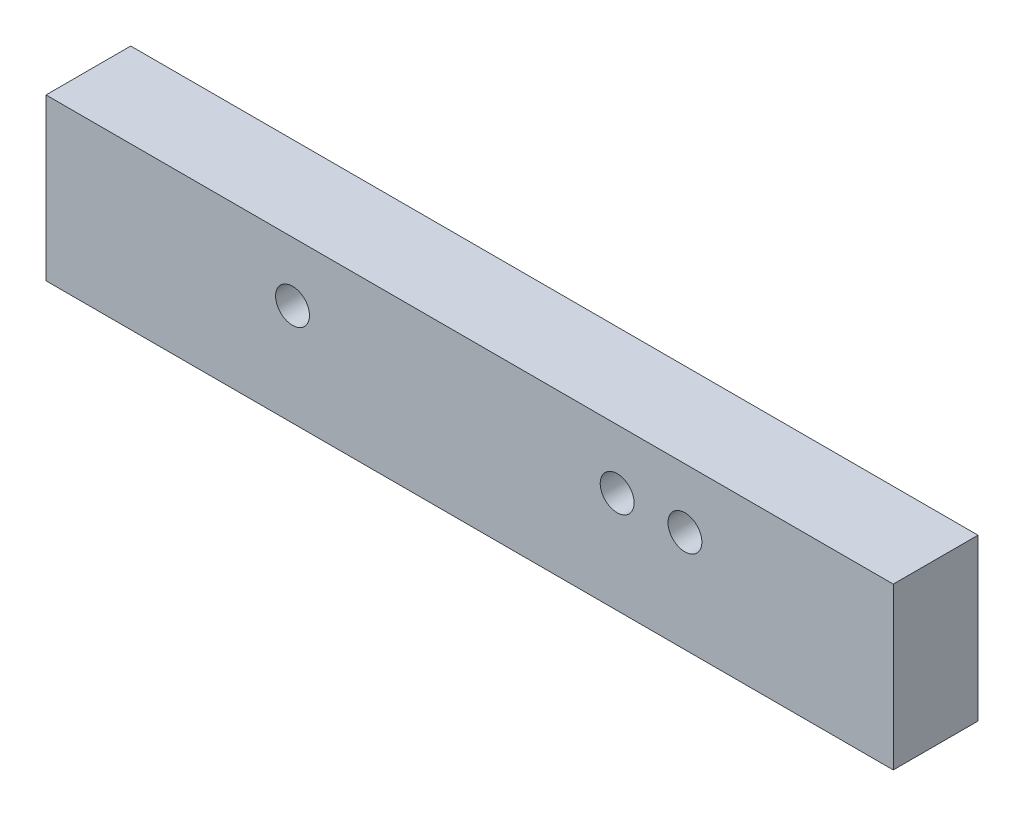
ISO-10303-21;
HEADER;
FILE_DESCRIPTION(('STEP AP214'),'2;1');
FILE_NAME('part.step','',(''),(''),'','','');
FILE_SCHEMA(('AUTOMOTIVE_DESIGN { 1 0 10303 214 1 1 1 1 }'));
ENDSEC;
DATA;
#1=APPLICATION_CONTEXT('core data for automotive mechanical design processes');
#2=APPLICATION_PROTOCOL_DEFINITION('international standard','automotive_design',2000,#1);
#3=PRODUCT_CONTEXT('',#1,'mechanical');
#4=PRODUCT('Part','Part','',(#3));
#5=PRODUCT_RELATED_PRODUCT_CATEGORY('part','',(#4));
#6=PRODUCT_DEFINITION_FORMATION('','',#4);
#7=PRODUCT_DEFINITION_CONTEXT('part definition',#1,'design');
#8=PRODUCT_DEFINITION('design','',#6,#7);
#9=PRODUCT_DEFINITION_SHAPE('','',#8);
#10=(LENGTH_UNIT() NAMED_UNIT(*) SI_UNIT(.MILLI.,.METRE.));
#11=(NAMED_UNIT(*) PLANE_ANGLE_UNIT() SI_UNIT($,.RADIAN.));
#12=(NAMED_UNIT(*) SI_UNIT($,.STERADIAN.) SOLID_ANGLE_UNIT());
#13=UNCERTAINTY_MEASURE_WITH_UNIT(LENGTH_MEASURE(1.E-05),#10,'distance_accuracy_value','');
#14=(GEOMETRIC_REPRESENTATION_CONTEXT(3) GLOBAL_UNCERTAINTY_ASSIGNED_CONTEXT((#13)) GLOBAL_UNIT_ASSIGNED_CONTEXT((#10,
#11,#12)) REPRESENTATION_CONTEXT('',''));
#15=CARTESIAN_POINT('',(0.,0.,0.));
#16=DIRECTION('',(0.,0.,1.));
#17=DIRECTION('',(1.,0.,0.));
#18=AXIS2_PLACEMENT_3D('',#15,#16,#17);
#19=CARTESIAN_POINT('',(-22.762367075413,19.5,51.));
#20=DIRECTION('',(0.,0.,-1.));
#21=DIRECTION('',(-1.,0.,0.));
#22=AXIS2_PLACEMENT_3D('',#19,#20,#21);
#23=PLANE('',#22);
#24=CARTESIAN_POINT('',(14.9428687581078,16.,51.));
#25=DIRECTION('',(0.,0.,-1.));
#26=DIRECTION('',(-1.,0.,0.));
#27=AXIS2_PLACEMENT_3D('',#24,#25,#26);
#28=CIRCLE('',#27,1.);
#29=CARTESIAN_POINT('',(13.9428687581078,16.,51.));
#30=VERTEX_POINT('',#29);
#31=EDGE_CURVE('E105',#30,#30,#28,.F.);
#32=ORIENTED_EDGE('',*,*,#31,.F.);
#33=EDGE_LOOP('',(#32));
#34=FACE_BOUND('',#33,.T.);
#35=CARTESIAN_POINT('',(10.9428687581078,16.,51.));
#36=DIRECTION('',(0.,0.,-1.));
#37=DIRECTION('',(-1.,0.,0.));
#38=AXIS2_PLACEMENT_3D('',#35,#36,#37);
#39=CIRCLE('',#38,1.);
#40=CARTESIAN_POINT('',(9.94286875810784,16.,51.));
#41=VERTEX_POINT('',#40);
#42=EDGE_CURVE('E119',#41,#41,#39,.F.);
#43=ORIENTED_EDGE('',*,*,#42,.F.);
#44=EDGE_LOOP('',(#43));
#45=FACE_BOUND('',#44,.T.);
#46=CARTESIAN_POINT('',(-8.2135610311844,16.,51.));
#47=DIRECTION('',(0.,0.,-1.));
#48=DIRECTION('',(-1.,0.,0.));
#49=AXIS2_PLACEMENT_3D('',#46,#47,#48);
#50=CIRCLE('',#49,1.);
#51=CARTESIAN_POINT('',(-9.2135610311844,16.,51.));
#52=VERTEX_POINT('',#51);
#53=EDGE_CURVE('E120',#52,#52,#50,.F.);
#54=ORIENTED_EDGE('',*,*,#53,.F.);
#55=EDGE_LOOP('',(#54));
#56=FACE_BOUND('',#55,.T.);
#57=DIRECTION('',(1.,0.,0.));
#58=VECTOR('',#57,1.);
#59=CARTESIAN_POINT('',(-22.762367075413,10.,51.));
#60=LINE('',#59,#58);
#61=CARTESIAN_POINT('',(-22.762367075413,10.,51.));
#62=VERTEX_POINT('',#61);
#63=CARTESIAN_POINT('',(27.237632924587,10.,51.));
#64=VERTEX_POINT('',#63);
#65=EDGE_CURVE('E102',#62,#64,#60,.T.);
#66=ORIENTED_EDGE('',*,*,#65,.T.);
#67=DIRECTION('',(0.,-1.,0.));
#68=VECTOR('',#67,1.);
#69=CARTESIAN_POINT('',(27.237632924587,19.5,51.));
#70=LINE('',#69,#68);
#71=CARTESIAN_POINT('',(27.237632924587,19.5,51.));
#72=VERTEX_POINT('',#71);
#73=EDGE_CURVE('E11',#72,#64,#70,.T.);
#74=ORIENTED_EDGE('',*,*,#73,.F.);
#75=DIRECTION('',(1.,0.,0.));
#76=VECTOR('',#75,1.);
#77=CARTESIAN_POINT('',(-22.762367075413,19.5,51.));
#78=LINE('',#77,#76);
#79=CARTESIAN_POINT('',(-22.762367075413,19.5,51.));
#80=VERTEX_POINT('',#79);
#81=EDGE_CURVE('E90',#80,#72,#78,.T.);
#82=ORIENTED_EDGE('',*,*,#81,.F.);
#83=DIRECTION('',(0.,-1.,0.));
#84=VECTOR('',#83,1.);
#85=CARTESIAN_POINT('',(-22.762367075413,19.5,51.));
#86=LINE('',#85,#84);
#87=EDGE_CURVE('E98',#80,#62,#86,.T.);
#88=ORIENTED_EDGE('',*,*,#87,.T.);
#89=EDGE_LOOP('',(#66,#74,#82,#88));
#90=FACE_BOUND('',#89,.T.);
#91=ADVANCED_FACE('F39',(#34,#45,#56,#90),#23,.F.);
#92=CARTESIAN_POINT('',(27.237632924587,19.5,51.));
#93=DIRECTION('',(-1.,0.,0.));
#94=DIRECTION('',(0.,0.,1.));
#95=AXIS2_PLACEMENT_3D('',#92,#93,#94);
#96=PLANE('',#95);
#97=DIRECTION('',(0.,0.,-1.));
#98=VECTOR('',#97,1.);
#99=CARTESIAN_POINT('',(27.237632924587,10.,51.));
#100=LINE('',#99,#98);
#101=CARTESIAN_POINT('',(27.237632924587,10.,46.));
#102=VERTEX_POINT('',#101);
#103=EDGE_CURVE('E94',#64,#102,#100,.T.);
#104=ORIENTED_EDGE('',*,*,#103,.T.);
#105=DIRECTION('',(0.,-1.,0.));
#106=VECTOR('',#105,1.);
#107=CARTESIAN_POINT('',(27.237632924587,19.5,46.));
#108=LINE('',#107,#106);
#109=CARTESIAN_POINT('',(27.237632924587,19.5,46.));
#110=VERTEX_POINT('',#109);
#111=EDGE_CURVE('E47',#110,#102,#108,.T.);
#112=ORIENTED_EDGE('',*,*,#111,.F.);
#113=DIRECTION('',(0.,0.,-1.));
#114=VECTOR('',#113,1.);
#115=CARTESIAN_POINT('',(27.237632924587,19.5,51.));
#116=LINE('',#115,#114);
#117=EDGE_CURVE('E85',#72,#110,#116,.T.);
#118=ORIENTED_EDGE('',*,*,#117,.F.);
#119=ORIENTED_EDGE('',*,*,#73,.T.);
#120=EDGE_LOOP('',(#104,#112,#118,#119));
#121=FACE_BOUND('',#120,.T.);
#122=ADVANCED_FACE('F93',(#121),#96,.F.);
#123=CARTESIAN_POINT('',(27.237632924587,19.5,46.));
#124=DIRECTION('',(0.,0.,1.));
#125=DIRECTION('',(1.,0.,0.));
#126=AXIS2_PLACEMENT_3D('',#123,#124,#125);
#127=PLANE('',#126);
#128=CARTESIAN_POINT('',(14.9428687581078,16.,46.));
#129=DIRECTION('',(0.,0.,-1.));
#130=DIRECTION('',(-1.,0.,0.));
#131=AXIS2_PLACEMENT_3D('',#128,#129,#130);
#132=CIRCLE('',#131,1.);
#133=CARTESIAN_POINT('',(13.9428687581078,16.,46.));
#134=VERTEX_POINT('',#133);
#135=EDGE_CURVE('E126',#134,#134,#132,.T.);
#136=ORIENTED_EDGE('',*,*,#135,.F.);
#137=EDGE_LOOP('',(#136));
#138=FACE_BOUND('',#137,.T.);
#139=CARTESIAN_POINT('',(10.9428687581078,16.,46.));
#140=DIRECTION('',(0.,0.,-1.));
#141=DIRECTION('',(-1.,0.,0.));
#142=AXIS2_PLACEMENT_3D('',#139,#140,#141);
#143=CIRCLE('',#142,1.);
#144=CARTESIAN_POINT('',(9.94286875810784,16.,46.));
#145=VERTEX_POINT('',#144);
#146=EDGE_CURVE('E123',#145,#145,#143,.T.);
#147=ORIENTED_EDGE('',*,*,#146,.F.);
#148=EDGE_LOOP('',(#147));
#149=FACE_BOUND('',#148,.T.);
#150=CARTESIAN_POINT('',(-8.2135610311844,16.,46.));
#151=DIRECTION('',(0.,0.,-1.));
#152=DIRECTION('',(-1.,0.,0.));
#153=AXIS2_PLACEMENT_3D('',#150,#151,#152);
#154=CIRCLE('',#153,1.);
#155=CARTESIAN_POINT('',(-9.2135610311844,16.,46.));
#156=VERTEX_POINT('',#155);
#157=EDGE_CURVE('E116',#156,#156,#154,.T.);
#158=ORIENTED_EDGE('',*,*,#157,.F.);
#159=EDGE_LOOP('',(#158));
#160=FACE_BOUND('',#159,.T.);
#161=DIRECTION('',(-1.,0.,0.));
#162=VECTOR('',#161,1.);
#163=CARTESIAN_POINT('',(27.237632924587,10.,46.));
#164=LINE('',#163,#162);
#165=CARTESIAN_POINT('',(-22.762367075413,10.,46.));
#166=VERTEX_POINT('',#165);
#167=EDGE_CURVE('E72',#102,#166,#164,.T.);
#168=ORIENTED_EDGE('',*,*,#167,.T.);
#169=DIRECTION('',(0.,-1.,0.));
#170=VECTOR('',#169,1.);
#171=CARTESIAN_POINT('',(-22.762367075413,19.5,46.));
#172=LINE('',#171,#170);
#173=CARTESIAN_POINT('',(-22.762367075413,19.5,46.));
#174=VERTEX_POINT('',#173);
#175=EDGE_CURVE('E95',#174,#166,#172,.T.);
#176=ORIENTED_EDGE('',*,*,#175,.F.);
#177=DIRECTION('',(-1.,0.,0.));
#178=VECTOR('',#177,1.);
#179=CARTESIAN_POINT('',(27.237632924587,19.5,46.));
#180=LINE('',#179,#178);
#181=EDGE_CURVE('E88',#110,#174,#180,.T.);
#182=ORIENTED_EDGE('',*,*,#181,.F.);
#183=ORIENTED_EDGE('',*,*,#111,.T.);
#184=EDGE_LOOP('',(#168,#176,#182,#183));
#185=FACE_BOUND('',#184,.T.);
#186=ADVANCED_FACE('F96',(#138,#149,#160,#185),#127,.F.);
#187=CARTESIAN_POINT('',(-22.762367075413,19.5,46.));
#188=DIRECTION('',(1.,0.,0.));
#189=DIRECTION('',(0.,0.,-1.));
#190=AXIS2_PLACEMENT_3D('',#187,#188,#189);
#191=PLANE('',#190);
#192=DIRECTION('',(0.,0.,1.));
#193=VECTOR('',#192,1.);
#194=CARTESIAN_POINT('',(-22.762367075413,10.,46.));
#195=LINE('',#194,#193);
#196=EDGE_CURVE('E78',#166,#62,#195,.T.);
#197=ORIENTED_EDGE('',*,*,#196,.T.);
#198=ORIENTED_EDGE('',*,*,#87,.F.);
#199=DIRECTION('',(0.,0.,1.));
#200=VECTOR('',#199,1.);
#201=CARTESIAN_POINT('',(-22.762367075413,19.5,46.));
#202=LINE('',#201,#200);
#203=EDGE_CURVE('E55',#174,#80,#202,.T.);
#204=ORIENTED_EDGE('',*,*,#203,.F.);
#205=ORIENTED_EDGE('',*,*,#175,.T.);
#206=EDGE_LOOP('',(#197,#198,#204,#205));
#207=FACE_BOUND('',#206,.T.);
#208=ADVANCED_FACE('F110',(#207),#191,.F.);
#209=CARTESIAN_POINT('',(0.,19.5,0.));
#210=DIRECTION('',(0.,1.,0.));
#211=DIRECTION('',(0.,0.,1.));
#212=AXIS2_PLACEMENT_3D('',#209,#210,#211);
#213=PLANE('',#212);
#214=ORIENTED_EDGE('',*,*,#81,.T.);
#215=ORIENTED_EDGE('',*,*,#117,.T.);
#216=ORIENTED_EDGE('',*,*,#181,.T.);
#217=ORIENTED_EDGE('',*,*,#203,.T.);
#218=EDGE_LOOP('',(#214,#215,#216,#217));
#219=FACE_BOUND('',#218,.T.);
#220=ADVANCED_FACE('F86',(#219),#213,.T.);
#221=CARTESIAN_POINT('',(0.,10.,0.));
#222=DIRECTION('',(0.,1.,0.));
#223=DIRECTION('',(0.,0.,1.));
#224=AXIS2_PLACEMENT_3D('',#221,#222,#223);
#225=PLANE('',#224);
#226=ORIENTED_EDGE('',*,*,#65,.F.);
#227=ORIENTED_EDGE('',*,*,#196,.F.);
#228=ORIENTED_EDGE('',*,*,#167,.F.);
#229=ORIENTED_EDGE('',*,*,#103,.F.);
#230=EDGE_LOOP('',(#226,#227,#228,#229));
#231=FACE_BOUND('',#230,.T.);
#232=ADVANCED_FACE('F113',(#231),#225,.F.);
#233=CARTESIAN_POINT('',(-8.2135610311844,16.,51.001));
#234=DIRECTION('',(0.,0.,-1.));
#235=DIRECTION('',(-1.,0.,0.));
#236=AXIS2_PLACEMENT_3D('',#233,#234,#235);
#237=CYLINDRICAL_SURFACE('',#236,1.);
#238=ORIENTED_EDGE('',*,*,#157,.T.);
#239=EDGE_LOOP('',(#238));
#240=FACE_BOUND('',#239,.T.);
#241=ORIENTED_EDGE('',*,*,#53,.T.);
#242=EDGE_LOOP('',(#241));
#243=FACE_BOUND('',#242,.T.);
#244=ADVANCED_FACE('F144',(#240,#243),#237,.F.);
#245=CARTESIAN_POINT('',(10.9428687581078,16.,51.001));
#246=DIRECTION('',(0.,0.,-1.));
#247=DIRECTION('',(-1.,0.,0.));
#248=AXIS2_PLACEMENT_3D('',#245,#246,#247);
#249=CYLINDRICAL_SURFACE('',#248,1.);
#250=ORIENTED_EDGE('',*,*,#146,.T.);
#251=EDGE_LOOP('',(#250));
#252=FACE_BOUND('',#251,.T.);
#253=ORIENTED_EDGE('',*,*,#42,.T.);
#254=EDGE_LOOP('',(#253));
#255=FACE_BOUND('',#254,.T.);
#256=ADVANCED_FACE('F147',(#252,#255),#249,.F.);
#257=CARTESIAN_POINT('',(14.9428687581078,16.,51.001));
#258=DIRECTION('',(0.,0.,-1.));
#259=DIRECTION('',(-1.,0.,0.));
#260=AXIS2_PLACEMENT_3D('',#257,#258,#259);
#261=CYLINDRICAL_SURFACE('',#260,1.);
#262=ORIENTED_EDGE('',*,*,#135,.T.);
#263=EDGE_LOOP('',(#262));
#264=FACE_BOUND('',#263,.T.);
#265=ORIENTED_EDGE('',*,*,#31,.T.);
#266=EDGE_LOOP('',(#265));
#267=FACE_BOUND('',#266,.T.);
#268=ADVANCED_FACE('F134',(#264,#267),#261,.F.);
#269=CLOSED_SHELL('',(#91,#122,#186,#208,#220,#232,#244,#256,#268));
#270=MANIFOLD_SOLID_BREP('B2',#269);
#271=ADVANCED_BREP_SHAPE_REPRESENTATION('',(#18,#270),#14);
#272=SHAPE_DEFINITION_REPRESENTATION(#9,#271);
ENDSEC;
END-ISO-10303-21;
